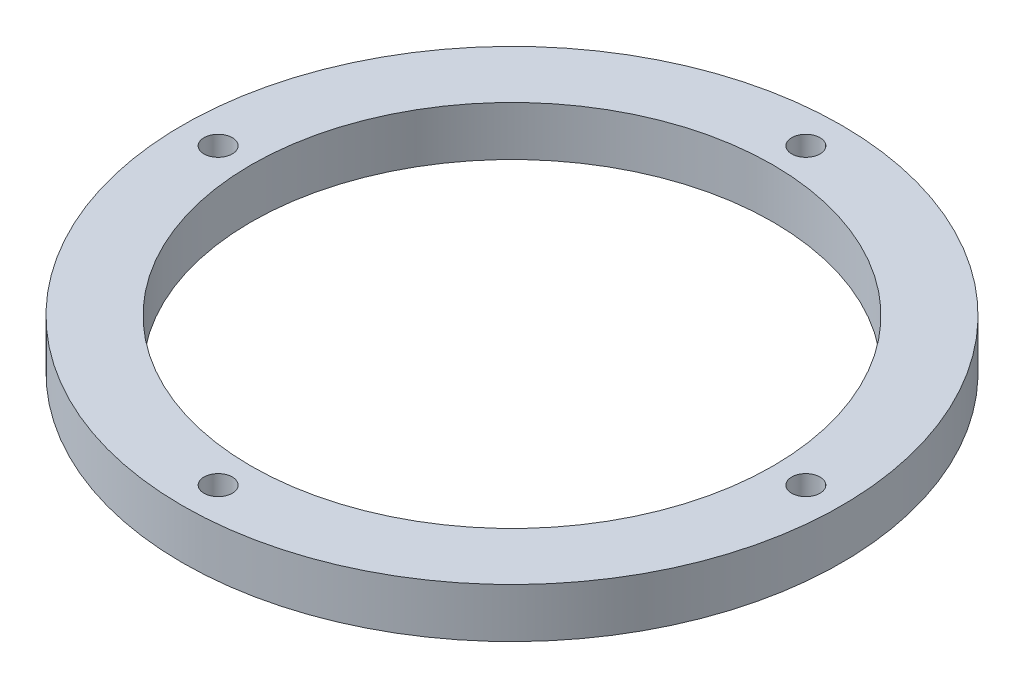
ISO-10303-21;
HEADER;
FILE_DESCRIPTION(('STEP AP214'),'2;1');
FILE_NAME('part.step','',(''),(''),'','','');
FILE_SCHEMA(('AUTOMOTIVE_DESIGN { 1 0 10303 214 1 1 1 1 }'));
ENDSEC;
DATA;
#1=APPLICATION_CONTEXT('core data for automotive mechanical design processes');
#2=APPLICATION_PROTOCOL_DEFINITION('international standard','automotive_design',2000,#1);
#3=PRODUCT_CONTEXT('',#1,'mechanical');
#4=PRODUCT('Part','Part','',(#3));
#5=PRODUCT_RELATED_PRODUCT_CATEGORY('part','',(#4));
#6=PRODUCT_DEFINITION_FORMATION('','',#4);
#7=PRODUCT_DEFINITION_CONTEXT('part definition',#1,'design');
#8=PRODUCT_DEFINITION('design','',#6,#7);
#9=PRODUCT_DEFINITION_SHAPE('','',#8);
#10=(LENGTH_UNIT() NAMED_UNIT(*) SI_UNIT(.MILLI.,.METRE.));
#11=(NAMED_UNIT(*) PLANE_ANGLE_UNIT() SI_UNIT($,.RADIAN.));
#12=(NAMED_UNIT(*) SI_UNIT($,.STERADIAN.) SOLID_ANGLE_UNIT());
#13=UNCERTAINTY_MEASURE_WITH_UNIT(LENGTH_MEASURE(1.E-05),#10,'distance_accuracy_value','');
#14=(GEOMETRIC_REPRESENTATION_CONTEXT(3) GLOBAL_UNCERTAINTY_ASSIGNED_CONTEXT((#13)) GLOBAL_UNIT_ASSIGNED_CONTEXT((#10,
#11,#12)) REPRESENTATION_CONTEXT('',''));
#15=CARTESIAN_POINT('',(0.,0.,0.));
#16=DIRECTION('',(0.,0.,1.));
#17=DIRECTION('',(1.,0.,0.));
#18=AXIS2_PLACEMENT_3D('',#15,#16,#17);
#19=CARTESIAN_POINT('',(0.,9.,0.));
#20=DIRECTION('',(0.,1.,0.));
#21=DIRECTION('',(0.,0.,1.));
#22=AXIS2_PLACEMENT_3D('',#19,#20,#21);
#23=PLANE('',#22);
#24=CARTESIAN_POINT('',(0.,9.,-53.5));
#25=DIRECTION('',(0.,1.,0.));
#26=DIRECTION('',(0.,0.,1.));
#27=AXIS2_PLACEMENT_3D('',#24,#25,#26);
#28=CIRCLE('',#27,2.575);
#29=CARTESIAN_POINT('',(0.,9.,-50.925));
#30=VERTEX_POINT('',#29);
#31=EDGE_CURVE('E84',#30,#30,#28,.T.);
#32=ORIENTED_EDGE('',*,*,#31,.F.);
#33=EDGE_LOOP('',(#32));
#34=FACE_BOUND('',#33,.T.);
#35=CARTESIAN_POINT('',(53.5,9.,1.86794251628108E-13));
#36=DIRECTION('',(0.,1.,0.));
#37=DIRECTION('',(0.,0.,1.));
#38=AXIS2_PLACEMENT_3D('',#35,#36,#37);
#39=CIRCLE('',#38,2.575);
#40=CARTESIAN_POINT('',(53.5,9.,2.57500000000019));
#41=VERTEX_POINT('',#40);
#42=EDGE_CURVE('E80',#41,#41,#39,.T.);
#43=ORIENTED_EDGE('',*,*,#42,.F.);
#44=EDGE_LOOP('',(#43));
#45=FACE_BOUND('',#44,.T.);
#46=CARTESIAN_POINT('',(-3.73588503256215E-13,9.,53.5));
#47=DIRECTION('',(0.,1.,0.));
#48=DIRECTION('',(0.,0.,1.));
#49=AXIS2_PLACEMENT_3D('',#46,#47,#48);
#50=CIRCLE('',#49,2.575);
#51=CARTESIAN_POINT('',(-3.73588503256215E-13,9.,56.075));
#52=VERTEX_POINT('',#51);
#53=EDGE_CURVE('E72',#52,#52,#50,.T.);
#54=ORIENTED_EDGE('',*,*,#53,.F.);
#55=EDGE_LOOP('',(#54));
#56=FACE_BOUND('',#55,.T.);
#57=CARTESIAN_POINT('',(-53.5,9.,-5.60382754884323E-13));
#58=DIRECTION('',(0.,1.,0.));
#59=DIRECTION('',(0.,0.,1.));
#60=AXIS2_PLACEMENT_3D('',#57,#58,#59);
#61=CIRCLE('',#60,2.575);
#62=CARTESIAN_POINT('',(-53.5,9.,2.57499999999944));
#63=VERTEX_POINT('',#62);
#64=EDGE_CURVE('E63',#63,#63,#61,.T.);
#65=ORIENTED_EDGE('',*,*,#64,.F.);
#66=EDGE_LOOP('',(#65));
#67=FACE_BOUND('',#66,.T.);
#68=CARTESIAN_POINT('',(0.,9.,0.));
#69=DIRECTION('',(0.,1.,0.));
#70=DIRECTION('',(0.,0.,1.));
#71=AXIS2_PLACEMENT_3D('',#68,#69,#70);
#72=CIRCLE('',#71,60.);
#73=CARTESIAN_POINT('',(0.,9.,60.));
#74=VERTEX_POINT('',#73);
#75=EDGE_CURVE('E10',#74,#74,#72,.T.);
#76=ORIENTED_EDGE('',*,*,#75,.T.);
#77=EDGE_LOOP('',(#76));
#78=FACE_BOUND('',#77,.T.);
#79=CARTESIAN_POINT('',(0.,9.,0.));
#80=DIRECTION('',(0.,1.,0.));
#81=DIRECTION('',(0.,0.,1.));
#82=AXIS2_PLACEMENT_3D('',#79,#80,#81);
#83=CIRCLE('',#82,47.5);
#84=CARTESIAN_POINT('',(0.,9.,47.5));
#85=VERTEX_POINT('',#84);
#86=EDGE_CURVE('E53',#85,#85,#83,.T.);
#87=ORIENTED_EDGE('',*,*,#86,.F.);
#88=EDGE_LOOP('',(#87));
#89=FACE_BOUND('',#88,.T.);
#90=ADVANCED_FACE('F40',(#34,#45,#56,#67,#78,#89),#23,.T.);
#91=CARTESIAN_POINT('',(0.,0.,0.));
#92=DIRECTION('',(0.,1.,0.));
#93=DIRECTION('',(0.,0.,1.));
#94=AXIS2_PLACEMENT_3D('',#91,#92,#93);
#95=PLANE('',#94);
#96=CARTESIAN_POINT('',(0.,0.,-53.5));
#97=DIRECTION('',(0.,1.,0.));
#98=DIRECTION('',(0.,0.,1.));
#99=AXIS2_PLACEMENT_3D('',#96,#97,#98);
#100=CIRCLE('',#99,2.575);
#101=CARTESIAN_POINT('',(0.,0.,-50.925));
#102=VERTEX_POINT('',#101);
#103=EDGE_CURVE('E59',#102,#102,#100,.F.);
#104=ORIENTED_EDGE('',*,*,#103,.F.);
#105=EDGE_LOOP('',(#104));
#106=FACE_BOUND('',#105,.T.);
#107=CARTESIAN_POINT('',(53.5,0.,1.86794251628108E-13));
#108=DIRECTION('',(0.,1.,0.));
#109=DIRECTION('',(0.,0.,1.));
#110=AXIS2_PLACEMENT_3D('',#107,#108,#109);
#111=CIRCLE('',#110,2.575);
#112=CARTESIAN_POINT('',(53.5,0.,2.57500000000019));
#113=VERTEX_POINT('',#112);
#114=EDGE_CURVE('E76',#113,#113,#111,.F.);
#115=ORIENTED_EDGE('',*,*,#114,.F.);
#116=EDGE_LOOP('',(#115));
#117=FACE_BOUND('',#116,.T.);
#118=CARTESIAN_POINT('',(-3.73588503256215E-13,0.,53.5));
#119=DIRECTION('',(0.,1.,0.));
#120=DIRECTION('',(0.,0.,1.));
#121=AXIS2_PLACEMENT_3D('',#118,#119,#120);
#122=CIRCLE('',#121,2.575);
#123=CARTESIAN_POINT('',(-3.73588503256215E-13,0.,56.075));
#124=VERTEX_POINT('',#123);
#125=EDGE_CURVE('E67',#124,#124,#122,.F.);
#126=ORIENTED_EDGE('',*,*,#125,.F.);
#127=EDGE_LOOP('',(#126));
#128=FACE_BOUND('',#127,.T.);
#129=CARTESIAN_POINT('',(-53.5,0.,-5.60382754884323E-13));
#130=DIRECTION('',(0.,1.,0.));
#131=DIRECTION('',(0.,0.,1.));
#132=AXIS2_PLACEMENT_3D('',#129,#130,#131);
#133=CIRCLE('',#132,2.575);
#134=CARTESIAN_POINT('',(-53.5,0.,2.57499999999944));
#135=VERTEX_POINT('',#134);
#136=EDGE_CURVE('E68',#135,#135,#133,.F.);
#137=ORIENTED_EDGE('',*,*,#136,.F.);
#138=EDGE_LOOP('',(#137));
#139=FACE_BOUND('',#138,.T.);
#140=CARTESIAN_POINT('',(0.,0.,0.));
#141=DIRECTION('',(0.,1.,0.));
#142=DIRECTION('',(0.,0.,1.));
#143=AXIS2_PLACEMENT_3D('',#140,#141,#142);
#144=CIRCLE('',#143,60.);
#145=CARTESIAN_POINT('',(0.,0.,60.));
#146=VERTEX_POINT('',#145);
#147=EDGE_CURVE('E44',#146,#146,#144,.T.);
#148=ORIENTED_EDGE('',*,*,#147,.F.);
#149=EDGE_LOOP('',(#148));
#150=FACE_BOUND('',#149,.T.);
#151=CARTESIAN_POINT('',(0.,0.,0.));
#152=DIRECTION('',(0.,1.,0.));
#153=DIRECTION('',(0.,0.,1.));
#154=AXIS2_PLACEMENT_3D('',#151,#152,#153);
#155=CIRCLE('',#154,47.5);
#156=CARTESIAN_POINT('',(0.,0.,47.5));
#157=VERTEX_POINT('',#156);
#158=EDGE_CURVE('E55',#157,#157,#155,.T.);
#159=ORIENTED_EDGE('',*,*,#158,.T.);
#160=EDGE_LOOP('',(#159));
#161=FACE_BOUND('',#160,.T.);
#162=ADVANCED_FACE('F100',(#106,#117,#128,#139,#150,#161),#95,.F.);
#163=CARTESIAN_POINT('',(0.,9.,0.));
#164=DIRECTION('',(0.,-1.,0.));
#165=DIRECTION('',(0.,0.,-1.));
#166=AXIS2_PLACEMENT_3D('',#163,#164,#165);
#167=CYLINDRICAL_SURFACE('',#166,60.);
#168=ORIENTED_EDGE('',*,*,#75,.F.);
#169=EDGE_LOOP('',(#168));
#170=FACE_BOUND('',#169,.T.);
#171=ORIENTED_EDGE('',*,*,#147,.T.);
#172=EDGE_LOOP('',(#171));
#173=FACE_BOUND('',#172,.T.);
#174=ADVANCED_FACE('F42',(#170,#173),#167,.T.);
#175=CARTESIAN_POINT('',(0.,9.,0.));
#176=DIRECTION('',(0.,-1.,0.));
#177=DIRECTION('',(0.,0.,-1.));
#178=AXIS2_PLACEMENT_3D('',#175,#176,#177);
#179=CYLINDRICAL_SURFACE('',#178,47.5);
#180=ORIENTED_EDGE('',*,*,#86,.T.);
#181=EDGE_LOOP('',(#180));
#182=FACE_BOUND('',#181,.T.);
#183=ORIENTED_EDGE('',*,*,#158,.F.);
#184=EDGE_LOOP('',(#183));
#185=FACE_BOUND('',#184,.T.);
#186=ADVANCED_FACE('F110',(#182,#185),#179,.F.);
#187=CARTESIAN_POINT('',(-53.5,-0.000999999999999265,-5.60382754884323E-13));
#188=DIRECTION('',(0.,1.,0.));
#189=DIRECTION('',(0.,0.,1.));
#190=AXIS2_PLACEMENT_3D('',#187,#188,#189);
#191=CYLINDRICAL_SURFACE('',#190,2.575);
#192=ORIENTED_EDGE('',*,*,#64,.T.);
#193=EDGE_LOOP('',(#192));
#194=FACE_BOUND('',#193,.T.);
#195=ORIENTED_EDGE('',*,*,#136,.T.);
#196=EDGE_LOOP('',(#195));
#197=FACE_BOUND('',#196,.T.);
#198=ADVANCED_FACE('F113',(#194,#197),#191,.F.);
#199=CARTESIAN_POINT('',(-3.73588503256215E-13,-0.000999999999999265,53.5));
#200=DIRECTION('',(0.,1.,0.));
#201=DIRECTION('',(0.,0.,1.));
#202=AXIS2_PLACEMENT_3D('',#199,#200,#201);
#203=CYLINDRICAL_SURFACE('',#202,2.575);
#204=ORIENTED_EDGE('',*,*,#53,.T.);
#205=EDGE_LOOP('',(#204));
#206=FACE_BOUND('',#205,.T.);
#207=ORIENTED_EDGE('',*,*,#125,.T.);
#208=EDGE_LOOP('',(#207));
#209=FACE_BOUND('',#208,.T.);
#210=ADVANCED_FACE('F129',(#206,#209),#203,.F.);
#211=CARTESIAN_POINT('',(53.5,-0.000999999999999265,1.86794251628108E-13));
#212=DIRECTION('',(0.,1.,0.));
#213=DIRECTION('',(0.,0.,1.));
#214=AXIS2_PLACEMENT_3D('',#211,#212,#213);
#215=CYLINDRICAL_SURFACE('',#214,2.575);
#216=ORIENTED_EDGE('',*,*,#42,.T.);
#217=EDGE_LOOP('',(#216));
#218=FACE_BOUND('',#217,.T.);
#219=ORIENTED_EDGE('',*,*,#114,.T.);
#220=EDGE_LOOP('',(#219));
#221=FACE_BOUND('',#220,.T.);
#222=ADVANCED_FACE('F133',(#218,#221),#215,.F.);
#223=CARTESIAN_POINT('',(0.,-0.000999999999999265,-53.5));
#224=DIRECTION('',(0.,1.,0.));
#225=DIRECTION('',(0.,0.,1.));
#226=AXIS2_PLACEMENT_3D('',#223,#224,#225);
#227=CYLINDRICAL_SURFACE('',#226,2.575);
#228=ORIENTED_EDGE('',*,*,#31,.T.);
#229=EDGE_LOOP('',(#228));
#230=FACE_BOUND('',#229,.T.);
#231=ORIENTED_EDGE('',*,*,#103,.T.);
#232=EDGE_LOOP('',(#231));
#233=FACE_BOUND('',#232,.T.);
#234=ADVANCED_FACE('F95',(#230,#233),#227,.F.);
#235=CLOSED_SHELL('',(#90,#162,#174,#186,#198,#210,#222,#234));
#236=MANIFOLD_SOLID_BREP('B2',#235);
#237=ADVANCED_BREP_SHAPE_REPRESENTATION('',(#18,#236),#14);
#238=SHAPE_DEFINITION_REPRESENTATION(#9,#237);
ENDSEC;
END-ISO-10303-21;
